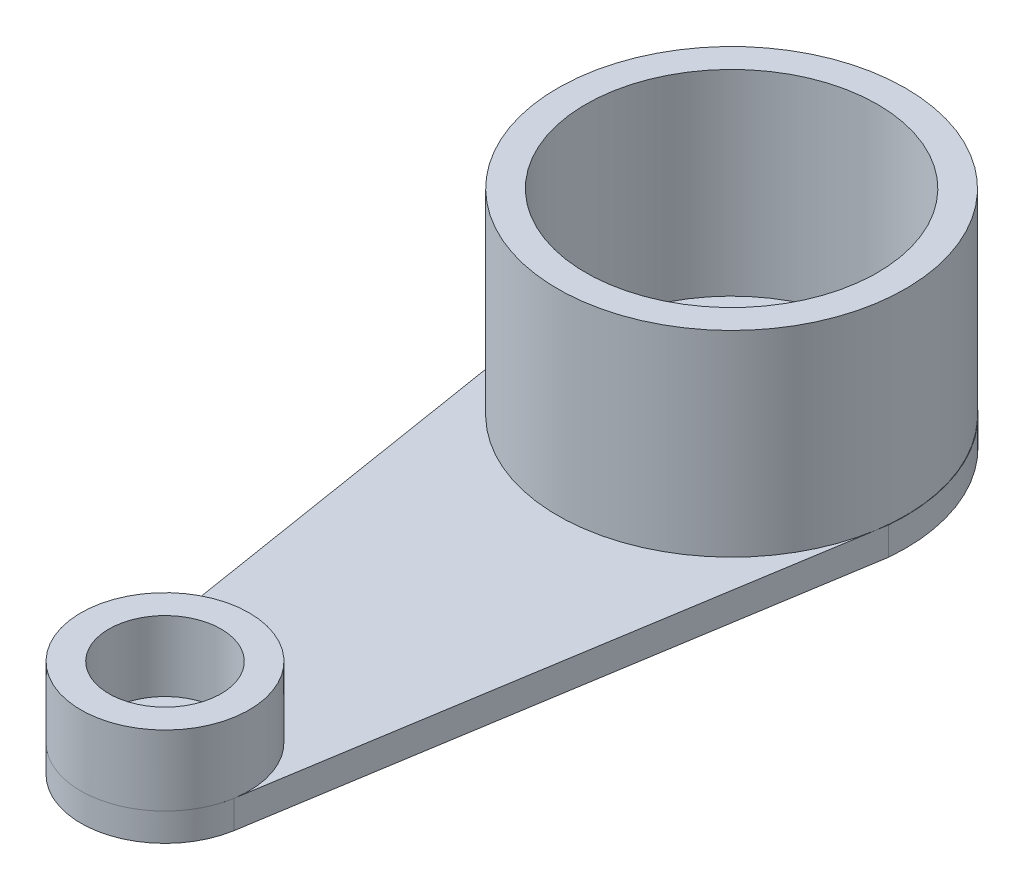
ISO-10303-21;
HEADER;
FILE_DESCRIPTION(('STEP AP214'),'2;1');
FILE_NAME('part.step','',(''),(''),'','','');
FILE_SCHEMA(('AUTOMOTIVE_DESIGN { 1 0 10303 214 1 1 1 1 }'));
ENDSEC;
DATA;
#1=APPLICATION_CONTEXT('core data for automotive mechanical design processes');
#2=APPLICATION_PROTOCOL_DEFINITION('international standard','automotive_design',2000,#1);
#3=PRODUCT_CONTEXT('',#1,'mechanical');
#4=PRODUCT('Part','Part','',(#3));
#5=PRODUCT_RELATED_PRODUCT_CATEGORY('part','',(#4));
#6=PRODUCT_DEFINITION_FORMATION('','',#4);
#7=PRODUCT_DEFINITION_CONTEXT('part definition',#1,'design');
#8=PRODUCT_DEFINITION('design','',#6,#7);
#9=PRODUCT_DEFINITION_SHAPE('','',#8);
#10=(LENGTH_UNIT() NAMED_UNIT(*) SI_UNIT(.MILLI.,.METRE.));
#11=(NAMED_UNIT(*) PLANE_ANGLE_UNIT() SI_UNIT($,.RADIAN.));
#12=(NAMED_UNIT(*) SI_UNIT($,.STERADIAN.) SOLID_ANGLE_UNIT());
#13=UNCERTAINTY_MEASURE_WITH_UNIT(LENGTH_MEASURE(1.E-05),#10,'distance_accuracy_value','');
#14=(GEOMETRIC_REPRESENTATION_CONTEXT(3) GLOBAL_UNCERTAINTY_ASSIGNED_CONTEXT((#13)) GLOBAL_UNIT_ASSIGNED_CONTEXT((#10,
#11,#12)) REPRESENTATION_CONTEXT('',''));
#15=CARTESIAN_POINT('',(0.,0.,0.));
#16=DIRECTION('',(0.,0.,1.));
#17=DIRECTION('',(1.,0.,0.));
#18=AXIS2_PLACEMENT_3D('',#15,#16,#17);
#19=CARTESIAN_POINT('',(0.,1.,-7.5097216334734));
#20=DIRECTION('',(0.,-1.,0.));
#21=DIRECTION('',(0.,0.,-1.));
#22=AXIS2_PLACEMENT_3D('',#19,#20,#21);
#23=PLANE('',#22);
#24=DIRECTION('',(-0.158415841584158,0.,0.987372483480871));
#25=VECTOR('',#24,1.);
#26=CARTESIAN_POINT('',(6.18471188034736,1.,-6.92022458473184));
#27=LINE('',#26,#25);
#28=CARTESIAN_POINT('',(6.1217093975814,1.,-6.52754341565162));
#29=VERTEX_POINT('',#28);
#30=CARTESIAN_POINT('',(2.96211745044261,1.,13.1655258912791));
#31=VERTEX_POINT('',#30);
#32=EDGE_CURVE('E68',#29,#31,#27,.T.);
#33=ORIENTED_EDGE('',*,*,#32,.F.);
#34=CARTESIAN_POINT('',(0.,1.,-7.5097216334734));
#35=DIRECTION('',(0.,-1.,0.));
#36=DIRECTION('',(0.,0.,-1.));
#37=AXIS2_PLACEMENT_3D('',#34,#35,#36);
#38=CIRCLE('',#37,6.2);
#39=CARTESIAN_POINT('',(-6.1217093975814,1.,-6.52754341565162));
#40=VERTEX_POINT('',#39);
#41=EDGE_CURVE('E61',#29,#40,#38,.T.);
#42=ORIENTED_EDGE('',*,*,#41,.T.);
#43=DIRECTION('',(0.158415841584158,0.,0.987372483480871));
#44=VECTOR('',#43,1.);
#45=CARTESIAN_POINT('',(-6.18471188034736,1.,-6.92022458473184));
#46=LINE('',#45,#44);
#47=CARTESIAN_POINT('',(-2.96211745044261,1.,13.1655258912791));
#48=VERTEX_POINT('',#47);
#49=EDGE_CURVE('E104',#40,#48,#46,.T.);
#50=ORIENTED_EDGE('',*,*,#49,.T.);
#51=CARTESIAN_POINT('',(0.,1.,12.6902783665266));
#52=DIRECTION('',(0.,-1.,0.));
#53=DIRECTION('',(0.,0.,-1.));
#54=AXIS2_PLACEMENT_3D('',#51,#52,#53);
#55=CIRCLE('',#54,3.);
#56=EDGE_CURVE('E143',#48,#31,#55,.T.);
#57=ORIENTED_EDGE('',*,*,#56,.T.);
#58=EDGE_LOOP('',(#33,#42,#50,#57));
#59=FACE_BOUND('',#58,.T.);
#60=ADVANCED_FACE('F45',(#59),#23,.F.);
#61=CARTESIAN_POINT('',(2.9574234236202,1.,13.194782769094));
#62=VERTEX_POINT('',#61);
#63=EDGE_CURVE('E135',#31,#62,#27,.T.);
#64=ORIENTED_EDGE('',*,*,#63,.F.);
#65=EDGE_CURVE('E139',#31,#48,#55,.T.);
#66=ORIENTED_EDGE('',*,*,#65,.T.);
#67=CARTESIAN_POINT('',(-2.9574234236202,1.,13.194782769094));
#68=VERTEX_POINT('',#67);
#69=EDGE_CURVE('E116',#48,#68,#46,.T.);
#70=ORIENTED_EDGE('',*,*,#69,.T.);
#71=CARTESIAN_POINT('',(0.,1.,12.6902783665266));
#72=DIRECTION('',(0.,1.,0.));
#73=DIRECTION('',(0.,0.,1.));
#74=AXIS2_PLACEMENT_3D('',#71,#72,#73);
#75=CIRCLE('',#74,3.00014632956249);
#76=EDGE_CURVE('E126',#68,#62,#75,.T.);
#77=ORIENTED_EDGE('',*,*,#76,.T.);
#78=EDGE_LOOP('',(#64,#66,#70,#77));
#79=FACE_BOUND('',#78,.T.);
#80=ADVANCED_FACE('F202',(#79),#23,.F.);
#81=CARTESIAN_POINT('',(0.,1.,-7.5097216334734));
#82=DIRECTION('',(0.,-1.,0.));
#83=DIRECTION('',(0.,0.,-1.));
#84=AXIS2_PLACEMENT_3D('',#81,#82,#83);
#85=CYLINDRICAL_SURFACE('',#84,6.21274237461887);
#86=CARTESIAN_POINT('',(0.,0.,-7.5097216334734));
#87=DIRECTION('',(0.,-1.,0.));
#88=DIRECTION('',(0.,0.,-1.));
#89=AXIS2_PLACEMENT_3D('',#86,#87,#88);
#90=CIRCLE('',#89,6.21274237461887);
#91=CARTESIAN_POINT('',(-6.18471188034736,0.,-6.92022458473184));
#92=VERTEX_POINT('',#91);
#93=CARTESIAN_POINT('',(6.18471188034736,0.,-6.92022458473184));
#94=VERTEX_POINT('',#93);
#95=EDGE_CURVE('E146',#92,#94,#90,.T.);
#96=ORIENTED_EDGE('',*,*,#95,.F.);
#97=DIRECTION('',(0.,-1.,0.));
#98=VECTOR('',#97,1.);
#99=CARTESIAN_POINT('',(-6.18471188034736,1.,-6.92022458473184));
#100=LINE('',#99,#98);
#101=CARTESIAN_POINT('',(-6.18471188034736,1.,-6.92022458473184));
#102=VERTEX_POINT('',#101);
#103=EDGE_CURVE('E175',#102,#92,#100,.T.);
#104=ORIENTED_EDGE('',*,*,#103,.F.);
#105=CARTESIAN_POINT('',(0.,1.,-7.5097216334734));
#106=DIRECTION('',(0.,-1.,0.));
#107=DIRECTION('',(0.,0.,-1.));
#108=AXIS2_PLACEMENT_3D('',#105,#106,#107);
#109=CIRCLE('',#108,6.21274237461887);
#110=CARTESIAN_POINT('',(6.18471188034736,1.,-6.92022458473184));
#111=VERTEX_POINT('',#110);
#112=EDGE_CURVE('E120',#102,#111,#109,.T.);
#113=ORIENTED_EDGE('',*,*,#112,.T.);
#114=DIRECTION('',(0.,-1.,0.));
#115=VECTOR('',#114,1.);
#116=CARTESIAN_POINT('',(6.18471188034736,1.,-6.92022458473184));
#117=LINE('',#116,#115);
#118=EDGE_CURVE('E121',#111,#94,#117,.T.);
#119=ORIENTED_EDGE('',*,*,#118,.T.);
#120=EDGE_LOOP('',(#96,#104,#113,#119));
#121=FACE_BOUND('',#120,.T.);
#122=ADVANCED_FACE('F47',(#121),#85,.T.);
#123=CARTESIAN_POINT('',(-6.18471188034736,1.,-6.92022458473184));
#124=DIRECTION('',(0.987372483480871,0.,-0.158415841584158));
#125=DIRECTION('',(-0.158415841584158,0.,-0.987372483480871));
#126=AXIS2_PLACEMENT_3D('',#123,#124,#125);
#127=PLANE('',#126);
#128=DIRECTION('',(0.158415841584158,0.,0.987372483480871));
#129=VECTOR('',#128,1.);
#130=CARTESIAN_POINT('',(-6.18471188034736,0.,-6.92022458473184));
#131=LINE('',#130,#129);
#132=CARTESIAN_POINT('',(-2.9574234236202,0.,13.194782769094));
#133=VERTEX_POINT('',#132);
#134=EDGE_CURVE('E138',#92,#133,#131,.T.);
#135=ORIENTED_EDGE('',*,*,#134,.T.);
#136=DIRECTION('',(0.,-1.,0.));
#137=VECTOR('',#136,1.);
#138=CARTESIAN_POINT('',(-2.9574234236202,1.,13.194782769094));
#139=LINE('',#138,#137);
#140=EDGE_CURVE('E172',#68,#133,#139,.T.);
#141=ORIENTED_EDGE('',*,*,#140,.F.);
#142=ORIENTED_EDGE('',*,*,#69,.F.);
#143=ORIENTED_EDGE('',*,*,#49,.F.);
#144=EDGE_CURVE('E113',#102,#40,#46,.T.);
#145=ORIENTED_EDGE('',*,*,#144,.F.);
#146=ORIENTED_EDGE('',*,*,#103,.T.);
#147=EDGE_LOOP('',(#135,#141,#142,#143,#145,#146));
#148=FACE_BOUND('',#147,.T.);
#149=ADVANCED_FACE('F112',(#148),#127,.F.);
#150=CARTESIAN_POINT('',(0.,1.,12.6902783665266));
#151=DIRECTION('',(0.,-1.,0.));
#152=DIRECTION('',(0.,0.,-1.));
#153=AXIS2_PLACEMENT_3D('',#150,#151,#152);
#154=CYLINDRICAL_SURFACE('',#153,3.00014632956249);
#155=CARTESIAN_POINT('',(0.,0.,12.6902783665266));
#156=DIRECTION('',(0.,1.,0.));
#157=DIRECTION('',(0.,0.,1.));
#158=AXIS2_PLACEMENT_3D('',#155,#156,#157);
#159=CIRCLE('',#158,3.00014632956249);
#160=CARTESIAN_POINT('',(2.9574234236202,0.,13.194782769094));
#161=VERTEX_POINT('',#160);
#162=EDGE_CURVE('E178',#133,#161,#159,.T.);
#163=ORIENTED_EDGE('',*,*,#162,.T.);
#164=DIRECTION('',(0.,-1.,0.));
#165=VECTOR('',#164,1.);
#166=CARTESIAN_POINT('',(2.9574234236202,1.,13.194782769094));
#167=LINE('',#166,#165);
#168=EDGE_CURVE('E122',#62,#161,#167,.T.);
#169=ORIENTED_EDGE('',*,*,#168,.F.);
#170=ORIENTED_EDGE('',*,*,#76,.F.);
#171=ORIENTED_EDGE('',*,*,#140,.T.);
#172=EDGE_LOOP('',(#163,#169,#170,#171));
#173=FACE_BOUND('',#172,.T.);
#174=ADVANCED_FACE('F193',(#173),#154,.T.);
#175=CARTESIAN_POINT('',(6.18471188034736,1.,-6.92022458473184));
#176=DIRECTION('',(0.987372483480871,0.,0.158415841584158));
#177=DIRECTION('',(0.158415841584158,0.,-0.987372483480871));
#178=AXIS2_PLACEMENT_3D('',#175,#176,#177);
#179=PLANE('',#178);
#180=DIRECTION('',(-0.158415841584158,0.,0.987372483480871));
#181=VECTOR('',#180,1.);
#182=CARTESIAN_POINT('',(6.18471188034736,0.,-6.92022458473184));
#183=LINE('',#182,#181);
#184=EDGE_CURVE('E181',#94,#161,#183,.T.);
#185=ORIENTED_EDGE('',*,*,#184,.F.);
#186=ORIENTED_EDGE('',*,*,#118,.F.);
#187=EDGE_CURVE('E130',#111,#29,#27,.T.);
#188=ORIENTED_EDGE('',*,*,#187,.T.);
#189=ORIENTED_EDGE('',*,*,#32,.T.);
#190=ORIENTED_EDGE('',*,*,#63,.T.);
#191=ORIENTED_EDGE('',*,*,#168,.T.);
#192=EDGE_LOOP('',(#185,#186,#188,#189,#190,#191));
#193=FACE_BOUND('',#192,.T.);
#194=ADVANCED_FACE('F191',(#193),#179,.T.);
#195=ORIENTED_EDGE('',*,*,#144,.T.);
#196=CARTESIAN_POINT('',(0.,1.,-7.5097216334734));
#197=DIRECTION('',(0.,-1.,0.));
#198=DIRECTION('',(0.,0.,-1.));
#199=AXIS2_PLACEMENT_3D('',#196,#197,#198);
#200=CIRCLE('',#199,6.2);
#201=EDGE_CURVE('E12',#40,#29,#200,.T.);
#202=ORIENTED_EDGE('',*,*,#201,.T.);
#203=ORIENTED_EDGE('',*,*,#187,.F.);
#204=ORIENTED_EDGE('',*,*,#112,.F.);
#205=EDGE_LOOP('',(#195,#202,#203,#204));
#206=FACE_BOUND('',#205,.T.);
#207=ADVANCED_FACE('F118',(#206),#23,.F.);
#208=CARTESIAN_POINT('',(0.,0.,-7.5097216334734));
#209=DIRECTION('',(0.,-1.,0.));
#210=DIRECTION('',(0.,0.,-1.));
#211=AXIS2_PLACEMENT_3D('',#208,#209,#210);
#212=PLANE('',#211);
#213=CARTESIAN_POINT('',(0.,0.,-7.5097216334734));
#214=DIRECTION('',(0.,1.,0.));
#215=DIRECTION('',(0.,0.,1.));
#216=AXIS2_PLACEMENT_3D('',#213,#214,#215);
#217=CIRCLE('',#216,0.85);
#218=CARTESIAN_POINT('',(0.,0.,-6.6597216334734));
#219=VERTEX_POINT('',#218);
#220=EDGE_CURVE('E159',#219,#219,#217,.T.);
#221=ORIENTED_EDGE('',*,*,#220,.T.);
#222=EDGE_LOOP('',(#221));
#223=FACE_BOUND('',#222,.T.);
#224=CARTESIAN_POINT('',(0.,0.,12.6902783665266));
#225=DIRECTION('',(0.,1.,0.));
#226=DIRECTION('',(0.,0.,1.));
#227=AXIS2_PLACEMENT_3D('',#224,#225,#226);
#228=CIRCLE('',#227,0.85);
#229=CARTESIAN_POINT('',(0.,0.,13.5402783665266));
#230=VERTEX_POINT('',#229);
#231=EDGE_CURVE('E156',#230,#230,#228,.T.);
#232=ORIENTED_EDGE('',*,*,#231,.T.);
#233=EDGE_LOOP('',(#232));
#234=FACE_BOUND('',#233,.T.);
#235=ORIENTED_EDGE('',*,*,#95,.T.);
#236=ORIENTED_EDGE('',*,*,#184,.T.);
#237=ORIENTED_EDGE('',*,*,#162,.F.);
#238=ORIENTED_EDGE('',*,*,#134,.F.);
#239=EDGE_LOOP('',(#235,#236,#237,#238));
#240=FACE_BOUND('',#239,.T.);
#241=ADVANCED_FACE('F187',(#223,#234,#240),#212,.T.);
#242=CARTESIAN_POINT('',(0.,3.5,12.6902783665266));
#243=DIRECTION('',(0.,-1.,0.));
#244=DIRECTION('',(0.,0.,-1.));
#245=AXIS2_PLACEMENT_3D('',#242,#243,#244);
#246=CYLINDRICAL_SURFACE('',#245,3.);
#247=CARTESIAN_POINT('',(0.,3.5,12.6902783665266));
#248=DIRECTION('',(0.,-1.,0.));
#249=DIRECTION('',(0.,0.,-1.));
#250=AXIS2_PLACEMENT_3D('',#247,#248,#249);
#251=CIRCLE('',#250,3.);
#252=CARTESIAN_POINT('',(0.,3.5,9.6902783665266));
#253=VERTEX_POINT('',#252);
#254=EDGE_CURVE('E141',#253,#253,#251,.T.);
#255=ORIENTED_EDGE('',*,*,#254,.T.);
#256=EDGE_LOOP('',(#255));
#257=FACE_BOUND('',#256,.T.);
#258=ORIENTED_EDGE('',*,*,#65,.F.);
#259=ORIENTED_EDGE('',*,*,#56,.F.);
#260=EDGE_LOOP('',(#258,#259));
#261=FACE_BOUND('',#260,.T.);
#262=ADVANCED_FACE('F219',(#257,#261),#246,.T.);
#263=CARTESIAN_POINT('',(0.,3.5,12.6902783665266));
#264=DIRECTION('',(0.,-1.,0.));
#265=DIRECTION('',(0.,0.,-1.));
#266=AXIS2_PLACEMENT_3D('',#263,#264,#265);
#267=PLANE('',#266);
#268=CARTESIAN_POINT('',(0.,3.5,12.6902783665266));
#269=DIRECTION('',(0.,-1.,0.));
#270=DIRECTION('',(0.,0.,-1.));
#271=AXIS2_PLACEMENT_3D('',#268,#269,#270);
#272=CIRCLE('',#271,2.);
#273=CARTESIAN_POINT('',(0.,3.5,10.6902783665266));
#274=VERTEX_POINT('',#273);
#275=EDGE_CURVE('E142',#274,#274,#272,.T.);
#276=ORIENTED_EDGE('',*,*,#275,.T.);
#277=EDGE_LOOP('',(#276));
#278=FACE_BOUND('',#277,.T.);
#279=ORIENTED_EDGE('',*,*,#254,.F.);
#280=EDGE_LOOP('',(#279));
#281=FACE_BOUND('',#280,.T.);
#282=ADVANCED_FACE('F223',(#278,#281),#267,.F.);
#283=CARTESIAN_POINT('',(0.,3.5,12.6902783665266));
#284=DIRECTION('',(0.,-1.,0.));
#285=DIRECTION('',(0.,0.,-1.));
#286=AXIS2_PLACEMENT_3D('',#283,#284,#285);
#287=CYLINDRICAL_SURFACE('',#286,2.);
#288=ORIENTED_EDGE('',*,*,#275,.F.);
#289=EDGE_LOOP('',(#288));
#290=FACE_BOUND('',#289,.T.);
#291=CARTESIAN_POINT('',(0.,1.,12.6902783665266));
#292=DIRECTION('',(0.,-1.,0.));
#293=DIRECTION('',(0.,0.,-1.));
#294=AXIS2_PLACEMENT_3D('',#291,#292,#293);
#295=CIRCLE('',#294,2.);
#296=CARTESIAN_POINT('',(0.,1.,10.6902783665266));
#297=VERTEX_POINT('',#296);
#298=EDGE_CURVE('E147',#297,#297,#295,.T.);
#299=ORIENTED_EDGE('',*,*,#298,.T.);
#300=EDGE_LOOP('',(#299));
#301=FACE_BOUND('',#300,.T.);
#302=ADVANCED_FACE('F236',(#290,#301),#287,.F.);
#303=CARTESIAN_POINT('',(0.,0.999999999999999,12.6902783665266));
#304=DIRECTION('',(0.,-1.,0.));
#305=DIRECTION('',(0.,0.,-1.));
#306=AXIS2_PLACEMENT_3D('',#303,#304,#305);
#307=CIRCLE('',#306,0.85);
#308=CARTESIAN_POINT('',(0.,0.999999999999999,11.8402783665266));
#309=VERTEX_POINT('',#308);
#310=EDGE_CURVE('E49',#309,#309,#307,.F.);
#311=ORIENTED_EDGE('',*,*,#310,.F.);
#312=EDGE_LOOP('',(#311));
#313=FACE_BOUND('',#312,.T.);
#314=ORIENTED_EDGE('',*,*,#298,.F.);
#315=EDGE_LOOP('',(#314));
#316=FACE_BOUND('',#315,.T.);
#317=ADVANCED_FACE('F208',(#313,#316),#23,.F.);
#318=CARTESIAN_POINT('',(0.,8.,-7.5097216334734));
#319=DIRECTION('',(0.,-1.,0.));
#320=DIRECTION('',(0.,0.,-1.));
#321=AXIS2_PLACEMENT_3D('',#318,#319,#320);
#322=CYLINDRICAL_SURFACE('',#321,6.2);
#323=CARTESIAN_POINT('',(0.,8.,-7.5097216334734));
#324=DIRECTION('',(0.,-1.,0.));
#325=DIRECTION('',(0.,0.,-1.));
#326=AXIS2_PLACEMENT_3D('',#323,#324,#325);
#327=CIRCLE('',#326,6.2);
#328=CARTESIAN_POINT('',(0.,8.,-13.7097216334734));
#329=VERTEX_POINT('',#328);
#330=EDGE_CURVE('E106',#329,#329,#327,.T.);
#331=ORIENTED_EDGE('',*,*,#330,.T.);
#332=EDGE_LOOP('',(#331));
#333=FACE_BOUND('',#332,.T.);
#334=ORIENTED_EDGE('',*,*,#41,.F.);
#335=ORIENTED_EDGE('',*,*,#201,.F.);
#336=EDGE_LOOP('',(#334,#335));
#337=FACE_BOUND('',#336,.T.);
#338=ADVANCED_FACE('F97',(#333,#337),#322,.T.);
#339=CARTESIAN_POINT('',(0.,8.,-7.5097216334734));
#340=DIRECTION('',(0.,-1.,0.));
#341=DIRECTION('',(0.,0.,-1.));
#342=AXIS2_PLACEMENT_3D('',#339,#340,#341);
#343=PLANE('',#342);
#344=CARTESIAN_POINT('',(0.,8.,-7.5097216334734));
#345=DIRECTION('',(0.,-1.,0.));
#346=DIRECTION('',(0.,0.,-1.));
#347=AXIS2_PLACEMENT_3D('',#344,#345,#346);
#348=CIRCLE('',#347,5.2);
#349=CARTESIAN_POINT('',(0.,8.,-12.7097216334734));
#350=VERTEX_POINT('',#349);
#351=EDGE_CURVE('E107',#350,#350,#348,.T.);
#352=ORIENTED_EDGE('',*,*,#351,.T.);
#353=EDGE_LOOP('',(#352));
#354=FACE_BOUND('',#353,.T.);
#355=ORIENTED_EDGE('',*,*,#330,.F.);
#356=EDGE_LOOP('',(#355));
#357=FACE_BOUND('',#356,.T.);
#358=ADVANCED_FACE('F251',(#354,#357),#343,.F.);
#359=CARTESIAN_POINT('',(0.,8.,-7.5097216334734));
#360=DIRECTION('',(0.,-1.,0.));
#361=DIRECTION('',(0.,0.,-1.));
#362=AXIS2_PLACEMENT_3D('',#359,#360,#361);
#363=CYLINDRICAL_SURFACE('',#362,5.2);
#364=ORIENTED_EDGE('',*,*,#351,.F.);
#365=EDGE_LOOP('',(#364));
#366=FACE_BOUND('',#365,.T.);
#367=CARTESIAN_POINT('',(0.,1.,-7.5097216334734));
#368=DIRECTION('',(0.,-1.,0.));
#369=DIRECTION('',(0.,0.,-1.));
#370=AXIS2_PLACEMENT_3D('',#367,#368,#369);
#371=CIRCLE('',#370,5.2);
#372=CARTESIAN_POINT('',(0.,1.,-12.7097216334734));
#373=VERTEX_POINT('',#372);
#374=EDGE_CURVE('E54',#373,#373,#371,.T.);
#375=ORIENTED_EDGE('',*,*,#374,.T.);
#376=EDGE_LOOP('',(#375));
#377=FACE_BOUND('',#376,.T.);
#378=ADVANCED_FACE('F213',(#366,#377),#363,.F.);
#379=CARTESIAN_POINT('',(0.,0.999999999999999,-7.5097216334734));
#380=DIRECTION('',(0.,-1.,0.));
#381=DIRECTION('',(0.,0.,-1.));
#382=AXIS2_PLACEMENT_3D('',#379,#380,#381);
#383=CIRCLE('',#382,0.85);
#384=CARTESIAN_POINT('',(0.,0.999999999999999,-8.3597216334734));
#385=VERTEX_POINT('',#384);
#386=EDGE_CURVE('E161',#385,#385,#383,.F.);
#387=ORIENTED_EDGE('',*,*,#386,.F.);
#388=EDGE_LOOP('',(#387));
#389=FACE_BOUND('',#388,.T.);
#390=ORIENTED_EDGE('',*,*,#374,.F.);
#391=EDGE_LOOP('',(#390));
#392=FACE_BOUND('',#391,.T.);
#393=ADVANCED_FACE('F204',(#389,#392),#23,.F.);
#394=CARTESIAN_POINT('',(0.,10.,-7.5097216334734));
#395=DIRECTION('',(0.,-1.,0.));
#396=DIRECTION('',(0.,0.,-1.));
#397=AXIS2_PLACEMENT_3D('',#394,#395,#396);
#398=CYLINDRICAL_SURFACE('',#397,0.85);
#399=ORIENTED_EDGE('',*,*,#220,.F.);
#400=EDGE_LOOP('',(#399));
#401=FACE_BOUND('',#400,.T.);
#402=ORIENTED_EDGE('',*,*,#386,.T.);
#403=EDGE_LOOP('',(#402));
#404=FACE_BOUND('',#403,.T.);
#405=ADVANCED_FACE('F212',(#401,#404),#398,.F.);
#406=CARTESIAN_POINT('',(0.,10.,12.6902783665266));
#407=DIRECTION('',(0.,-1.,0.));
#408=DIRECTION('',(0.,0.,-1.));
#409=AXIS2_PLACEMENT_3D('',#406,#407,#408);
#410=CYLINDRICAL_SURFACE('',#409,0.85);
#411=ORIENTED_EDGE('',*,*,#231,.F.);
#412=EDGE_LOOP('',(#411));
#413=FACE_BOUND('',#412,.T.);
#414=ORIENTED_EDGE('',*,*,#310,.T.);
#415=EDGE_LOOP('',(#414));
#416=FACE_BOUND('',#415,.T.);
#417=ADVANCED_FACE('F228',(#413,#416),#410,.F.);
#418=CLOSED_SHELL('',(#60,#80,#122,#149,#174,#194,#207,#241,#262,#282,#302,#317,#338,#358,#378,
#393,#405,#417));
#419=MANIFOLD_SOLID_BREP('B2',#418);
#420=ADVANCED_BREP_SHAPE_REPRESENTATION('',(#18,#419),#14);
#421=SHAPE_DEFINITION_REPRESENTATION(#9,#420);
ENDSEC;
END-ISO-10303-21;
